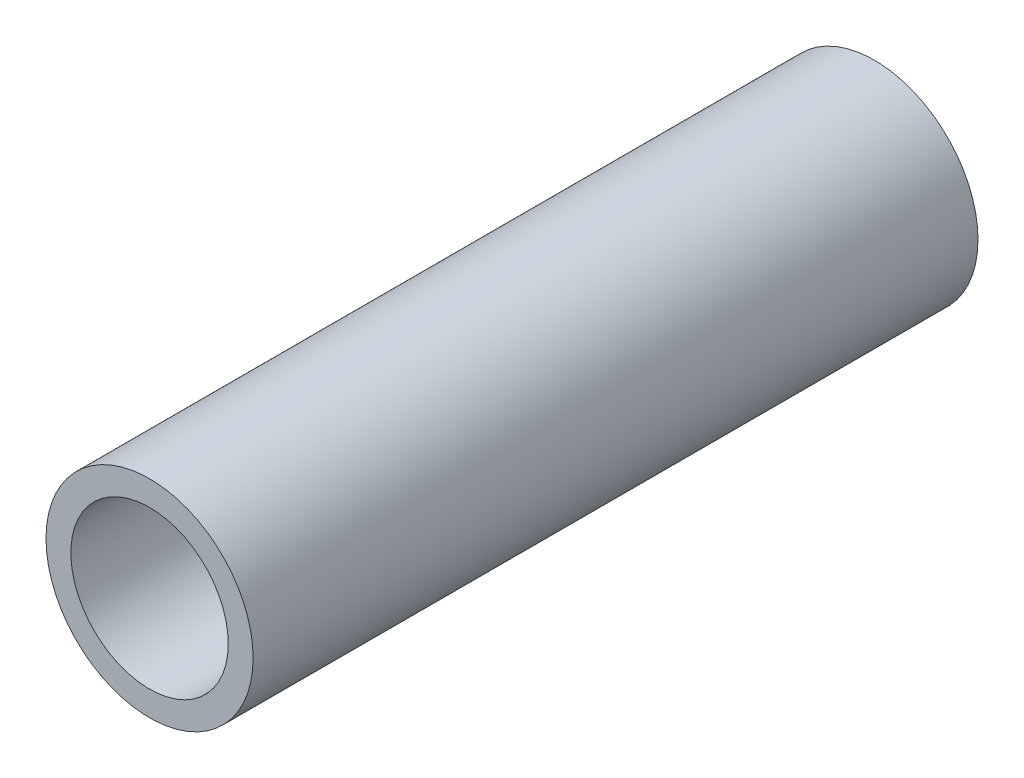
ISO-10303-21;
HEADER;
FILE_DESCRIPTION(('STEP AP214'),'2;1');
FILE_NAME('part.step','',(''),(''),'','','');
FILE_SCHEMA(('AUTOMOTIVE_DESIGN { 1 0 10303 214 1 1 1 1 }'));
ENDSEC;
DATA;
#1=APPLICATION_CONTEXT('core data for automotive mechanical design processes');
#2=APPLICATION_PROTOCOL_DEFINITION('international standard','automotive_design',2000,#1);
#3=PRODUCT_CONTEXT('',#1,'mechanical');
#4=PRODUCT('Part','Part','',(#3));
#5=PRODUCT_RELATED_PRODUCT_CATEGORY('part','',(#4));
#6=PRODUCT_DEFINITION_FORMATION('','',#4);
#7=PRODUCT_DEFINITION_CONTEXT('part definition',#1,'design');
#8=PRODUCT_DEFINITION('design','',#6,#7);
#9=PRODUCT_DEFINITION_SHAPE('','',#8);
#10=(LENGTH_UNIT() NAMED_UNIT(*) SI_UNIT(.MILLI.,.METRE.));
#11=(NAMED_UNIT(*) PLANE_ANGLE_UNIT() SI_UNIT($,.RADIAN.));
#12=(NAMED_UNIT(*) SI_UNIT($,.STERADIAN.) SOLID_ANGLE_UNIT());
#13=UNCERTAINTY_MEASURE_WITH_UNIT(LENGTH_MEASURE(1.E-05),#10,'distance_accuracy_value','');
#14=(GEOMETRIC_REPRESENTATION_CONTEXT(3) GLOBAL_UNCERTAINTY_ASSIGNED_CONTEXT((#13)) GLOBAL_UNIT_ASSIGNED_CONTEXT((#10,
#11,#12)) REPRESENTATION_CONTEXT('',''));
#15=CARTESIAN_POINT('',(0.,0.,0.));
#16=DIRECTION('',(0.,0.,1.));
#17=DIRECTION('',(1.,0.,0.));
#18=AXIS2_PLACEMENT_3D('',#15,#16,#17);
#19=CARTESIAN_POINT('',(0.,0.,22.225));
#20=DIRECTION('',(0.,0.,1.));
#21=DIRECTION('',(1.,0.,0.));
#22=AXIS2_PLACEMENT_3D('',#19,#20,#21);
#23=PLANE('',#22);
#24=CARTESIAN_POINT('',(0.,0.,22.225));
#25=DIRECTION('',(0.,0.,1.));
#26=DIRECTION('',(1.,0.,0.));
#27=AXIS2_PLACEMENT_3D('',#24,#25,#26);
#28=CIRCLE('',#27,6.35);
#29=CARTESIAN_POINT('',(6.35,0.,22.225));
#30=VERTEX_POINT('',#29);
#31=EDGE_CURVE('E10',#30,#30,#28,.T.);
#32=ORIENTED_EDGE('',*,*,#31,.T.);
#33=EDGE_LOOP('',(#32));
#34=FACE_BOUND('',#33,.T.);
#35=CARTESIAN_POINT('',(0.,0.,22.225));
#36=DIRECTION('',(0.,0.,1.));
#37=DIRECTION('',(1.,0.,0.));
#38=AXIS2_PLACEMENT_3D('',#35,#36,#37);
#39=CIRCLE('',#38,4.826);
#40=CARTESIAN_POINT('',(4.826,0.,22.225));
#41=VERTEX_POINT('',#40);
#42=EDGE_CURVE('E46',#41,#41,#39,.T.);
#43=ORIENTED_EDGE('',*,*,#42,.F.);
#44=EDGE_LOOP('',(#43));
#45=FACE_BOUND('',#44,.T.);
#46=ADVANCED_FACE('F35',(#34,#45),#23,.T.);
#47=CARTESIAN_POINT('',(0.,0.,-22.225));
#48=DIRECTION('',(0.,0.,1.));
#49=DIRECTION('',(1.,0.,0.));
#50=AXIS2_PLACEMENT_3D('',#47,#48,#49);
#51=PLANE('',#50);
#52=CARTESIAN_POINT('',(0.,0.,-22.225));
#53=DIRECTION('',(0.,0.,1.));
#54=DIRECTION('',(1.,0.,0.));
#55=AXIS2_PLACEMENT_3D('',#52,#53,#54);
#56=CIRCLE('',#55,6.35);
#57=CARTESIAN_POINT('',(6.35,0.,-22.225));
#58=VERTEX_POINT('',#57);
#59=EDGE_CURVE('E39',#58,#58,#56,.T.);
#60=ORIENTED_EDGE('',*,*,#59,.F.);
#61=EDGE_LOOP('',(#60));
#62=FACE_BOUND('',#61,.T.);
#63=CARTESIAN_POINT('',(0.,0.,-22.225));
#64=DIRECTION('',(0.,0.,1.));
#65=DIRECTION('',(1.,0.,0.));
#66=AXIS2_PLACEMENT_3D('',#63,#64,#65);
#67=CIRCLE('',#66,4.826);
#68=CARTESIAN_POINT('',(4.826,0.,-22.225));
#69=VERTEX_POINT('',#68);
#70=EDGE_CURVE('E48',#69,#69,#67,.T.);
#71=ORIENTED_EDGE('',*,*,#70,.T.);
#72=EDGE_LOOP('',(#71));
#73=FACE_BOUND('',#72,.T.);
#74=ADVANCED_FACE('F58',(#62,#73),#51,.F.);
#75=CARTESIAN_POINT('',(0.,0.,22.225));
#76=DIRECTION('',(0.,0.,-1.));
#77=DIRECTION('',(-1.,0.,0.));
#78=AXIS2_PLACEMENT_3D('',#75,#76,#77);
#79=CYLINDRICAL_SURFACE('',#78,6.35);
#80=ORIENTED_EDGE('',*,*,#31,.F.);
#81=EDGE_LOOP('',(#80));
#82=FACE_BOUND('',#81,.T.);
#83=ORIENTED_EDGE('',*,*,#59,.T.);
#84=EDGE_LOOP('',(#83));
#85=FACE_BOUND('',#84,.T.);
#86=ADVANCED_FACE('F37',(#82,#85),#79,.T.);
#87=CARTESIAN_POINT('',(0.,0.,22.225));
#88=DIRECTION('',(0.,0.,-1.));
#89=DIRECTION('',(-1.,0.,0.));
#90=AXIS2_PLACEMENT_3D('',#87,#88,#89);
#91=CYLINDRICAL_SURFACE('',#90,4.826);
#92=ORIENTED_EDGE('',*,*,#42,.T.);
#93=EDGE_LOOP('',(#92));
#94=FACE_BOUND('',#93,.T.);
#95=ORIENTED_EDGE('',*,*,#70,.F.);
#96=EDGE_LOOP('',(#95));
#97=FACE_BOUND('',#96,.T.);
#98=ADVANCED_FACE('F54',(#94,#97),#91,.F.);
#99=CLOSED_SHELL('',(#46,#74,#86,#98));
#100=MANIFOLD_SOLID_BREP('B2',#99);
#101=ADVANCED_BREP_SHAPE_REPRESENTATION('',(#18,#100),#14);
#102=SHAPE_DEFINITION_REPRESENTATION(#9,#101);
ENDSEC;
END-ISO-10303-21;
